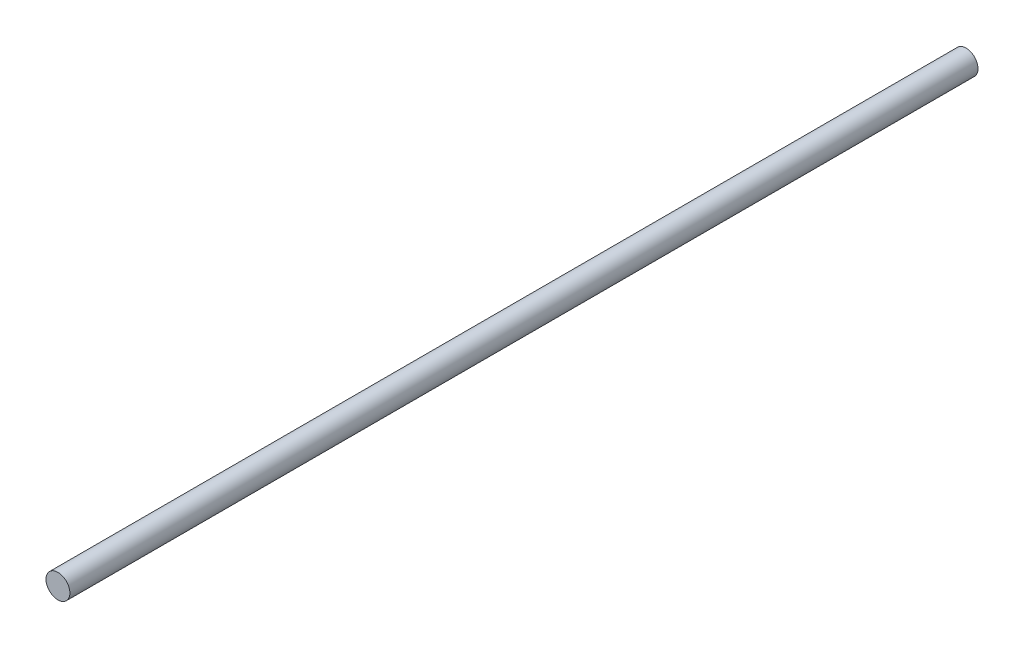
ISO-10303-21;
HEADER;
FILE_DESCRIPTION(('STEP AP214'),'2;1');
FILE_NAME('part.step','',(''),(''),'','','');
FILE_SCHEMA(('AUTOMOTIVE_DESIGN { 1 0 10303 214 1 1 1 1 }'));
ENDSEC;
DATA;
#1=APPLICATION_CONTEXT('core data for automotive mechanical design processes');
#2=APPLICATION_PROTOCOL_DEFINITION('international standard','automotive_design',2000,#1);
#3=PRODUCT_CONTEXT('',#1,'mechanical');
#4=PRODUCT('Part','Part','',(#3));
#5=PRODUCT_RELATED_PRODUCT_CATEGORY('part','',(#4));
#6=PRODUCT_DEFINITION_FORMATION('','',#4);
#7=PRODUCT_DEFINITION_CONTEXT('part definition',#1,'design');
#8=PRODUCT_DEFINITION('design','',#6,#7);
#9=PRODUCT_DEFINITION_SHAPE('','',#8);
#10=(LENGTH_UNIT() NAMED_UNIT(*) SI_UNIT(.MILLI.,.METRE.));
#11=(NAMED_UNIT(*) PLANE_ANGLE_UNIT() SI_UNIT($,.RADIAN.));
#12=(NAMED_UNIT(*) SI_UNIT($,.STERADIAN.) SOLID_ANGLE_UNIT());
#13=UNCERTAINTY_MEASURE_WITH_UNIT(LENGTH_MEASURE(1.E-05),#10,'distance_accuracy_value','');
#14=(GEOMETRIC_REPRESENTATION_CONTEXT(3) GLOBAL_UNCERTAINTY_ASSIGNED_CONTEXT((#13)) GLOBAL_UNIT_ASSIGNED_CONTEXT((#10,
#11,#12)) REPRESENTATION_CONTEXT('',''));
#15=CARTESIAN_POINT('',(0.,0.,0.));
#16=DIRECTION('',(0.,0.,1.));
#17=DIRECTION('',(1.,0.,0.));
#18=AXIS2_PLACEMENT_3D('',#15,#16,#17);
#19=CARTESIAN_POINT('',(0.,0.,190.));
#20=DIRECTION('',(0.,0.,-1.));
#21=DIRECTION('',(-1.,0.,0.));
#22=AXIS2_PLACEMENT_3D('',#19,#20,#21);
#23=CYLINDRICAL_SURFACE('',#22,2.5);
#24=CARTESIAN_POINT('',(0.,0.,190.));
#25=DIRECTION('',(0.,0.,1.));
#26=DIRECTION('',(1.,0.,0.));
#27=AXIS2_PLACEMENT_3D('',#24,#25,#26);
#28=CIRCLE('',#27,2.5);
#29=CARTESIAN_POINT('',(2.5,0.,190.));
#30=VERTEX_POINT('',#29);
#31=EDGE_CURVE('E10',#30,#30,#28,.T.);
#32=ORIENTED_EDGE('',*,*,#31,.F.);
#33=EDGE_LOOP('',(#32));
#34=FACE_BOUND('',#33,.T.);
#35=CARTESIAN_POINT('',(0.,0.,0.));
#36=DIRECTION('',(0.,0.,1.));
#37=DIRECTION('',(1.,0.,0.));
#38=AXIS2_PLACEMENT_3D('',#35,#36,#37);
#39=CIRCLE('',#38,2.5);
#40=CARTESIAN_POINT('',(2.5,0.,0.));
#41=VERTEX_POINT('',#40);
#42=EDGE_CURVE('E34',#41,#41,#39,.T.);
#43=ORIENTED_EDGE('',*,*,#42,.T.);
#44=EDGE_LOOP('',(#43));
#45=FACE_BOUND('',#44,.T.);
#46=ADVANCED_FACE('F31',(#34,#45),#23,.T.);
#47=CARTESIAN_POINT('',(0.,0.,190.));
#48=DIRECTION('',(0.,0.,1.));
#49=DIRECTION('',(1.,0.,0.));
#50=AXIS2_PLACEMENT_3D('',#47,#48,#49);
#51=PLANE('',#50);
#52=ORIENTED_EDGE('',*,*,#31,.T.);
#53=EDGE_LOOP('',(#52));
#54=FACE_BOUND('',#53,.T.);
#55=ADVANCED_FACE('F46',(#54),#51,.T.);
#56=CARTESIAN_POINT('',(0.,0.,0.));
#57=DIRECTION('',(0.,0.,1.));
#58=DIRECTION('',(1.,0.,0.));
#59=AXIS2_PLACEMENT_3D('',#56,#57,#58);
#60=PLANE('',#59);
#61=ORIENTED_EDGE('',*,*,#42,.F.);
#62=EDGE_LOOP('',(#61));
#63=FACE_BOUND('',#62,.T.);
#64=ADVANCED_FACE('F44',(#63),#60,.F.);
#65=CLOSED_SHELL('',(#46,#55,#64));
#66=MANIFOLD_SOLID_BREP('B2',#65);
#67=ADVANCED_BREP_SHAPE_REPRESENTATION('',(#18,#66),#14);
#68=SHAPE_DEFINITION_REPRESENTATION(#9,#67);
ENDSEC;
END-ISO-10303-21;
